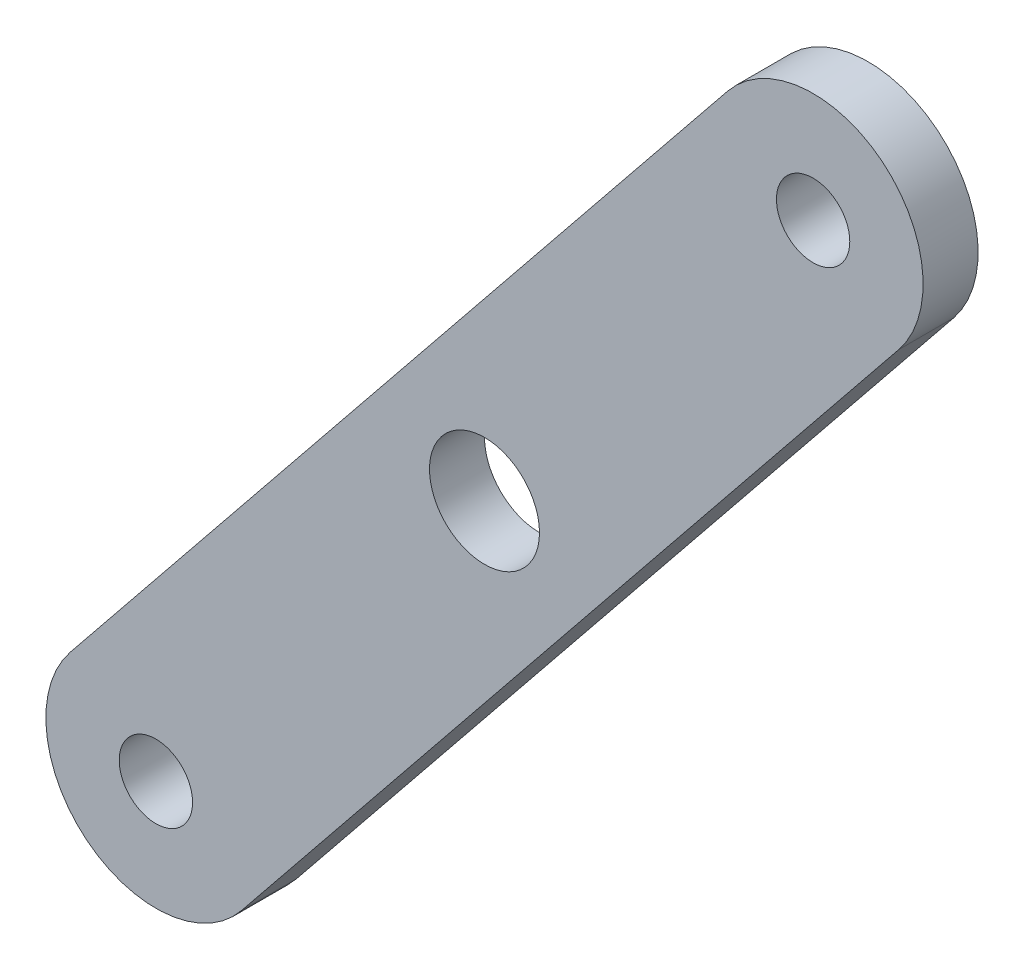
ISO-10303-21;
HEADER;
FILE_DESCRIPTION(('STEP AP214'),'2;1');
FILE_NAME('part.step','',(''),(''),'','','');
FILE_SCHEMA(('AUTOMOTIVE_DESIGN { 1 0 10303 214 1 1 1 1 }'));
ENDSEC;
DATA;
#1=APPLICATION_CONTEXT('core data for automotive mechanical design processes');
#2=APPLICATION_PROTOCOL_DEFINITION('international standard','automotive_design',2000,#1);
#3=PRODUCT_CONTEXT('',#1,'mechanical');
#4=PRODUCT('Part','Part','',(#3));
#5=PRODUCT_RELATED_PRODUCT_CATEGORY('part','',(#4));
#6=PRODUCT_DEFINITION_FORMATION('','',#4);
#7=PRODUCT_DEFINITION_CONTEXT('part definition',#1,'design');
#8=PRODUCT_DEFINITION('design','',#6,#7);
#9=PRODUCT_DEFINITION_SHAPE('','',#8);
#10=(LENGTH_UNIT() NAMED_UNIT(*) SI_UNIT(.MILLI.,.METRE.));
#11=(NAMED_UNIT(*) PLANE_ANGLE_UNIT() SI_UNIT($,.RADIAN.));
#12=(NAMED_UNIT(*) SI_UNIT($,.STERADIAN.) SOLID_ANGLE_UNIT());
#13=UNCERTAINTY_MEASURE_WITH_UNIT(LENGTH_MEASURE(1.E-05),#10,'distance_accuracy_value','');
#14=(GEOMETRIC_REPRESENTATION_CONTEXT(3) GLOBAL_UNCERTAINTY_ASSIGNED_CONTEXT((#13)) GLOBAL_UNIT_ASSIGNED_CONTEXT((#10,
#11,#12)) REPRESENTATION_CONTEXT('',''));
#15=CARTESIAN_POINT('',(0.,0.,0.));
#16=DIRECTION('',(0.,0.,1.));
#17=DIRECTION('',(1.,0.,0.));
#18=AXIS2_PLACEMENT_3D('',#15,#16,#17);
#19=CARTESIAN_POINT('',(10.899952642612,-8.75740448502151,1.5));
#20=DIRECTION('',(0.,0.,1.));
#21=DIRECTION('',(1.,0.,0.));
#22=AXIS2_PLACEMENT_3D('',#19,#20,#21);
#23=PLANE('',#22);
#24=CARTESIAN_POINT('',(28.8235524602542,13.4524169815508,1.5));
#25=DIRECTION('',(0.,0.,1.));
#26=DIRECTION('',(1.,0.,0.));
#27=AXIS2_PLACEMENT_3D('',#24,#25,#26);
#28=CIRCLE('',#27,1.);
#29=CARTESIAN_POINT('',(29.8235524602542,13.4524169815508,1.5));
#30=VERTEX_POINT('',#29);
#31=EDGE_CURVE('E117',#30,#30,#28,.T.);
#32=ORIENTED_EDGE('',*,*,#31,.F.);
#33=EDGE_LOOP('',(#32));
#34=FACE_BOUND('',#33,.T.);
#35=CARTESIAN_POINT('',(10.899952642612,-8.75740448502151,1.5));
#36=DIRECTION('',(0.,0.,1.));
#37=DIRECTION('',(1.,0.,0.));
#38=AXIS2_PLACEMENT_3D('',#35,#36,#37);
#39=CIRCLE('',#38,3.);
#40=CARTESIAN_POINT('',(8.56535332937732,-6.87335404868911,1.5));
#41=VERTEX_POINT('',#40);
#42=CARTESIAN_POINT('',(13.2345519558466,-10.6414549213539,1.5));
#43=VERTEX_POINT('',#42);
#44=EDGE_CURVE('E87',#41,#43,#39,.T.);
#45=ORIENTED_EDGE('',*,*,#44,.T.);
#46=DIRECTION('',(0.6280168121108,0.778199771078216,0.));
#47=VECTOR('',#46,1.);
#48=CARTESIAN_POINT('',(13.2345519558466,-10.6414549213539,1.5));
#49=LINE('',#48,#47);
#50=CARTESIAN_POINT('',(31.1581517734888,11.5683665452184,1.5));
#51=VERTEX_POINT('',#50);
#52=EDGE_CURVE('E82',#43,#51,#49,.T.);
#53=ORIENTED_EDGE('',*,*,#52,.T.);
#54=CARTESIAN_POINT('',(28.8235524602542,13.4524169815508,1.5));
#55=DIRECTION('',(0.,0.,1.));
#56=DIRECTION('',(1.,0.,0.));
#57=AXIS2_PLACEMENT_3D('',#54,#55,#56);
#58=CIRCLE('',#57,3.);
#59=CARTESIAN_POINT('',(26.4889531470196,15.3364674178832,1.5));
#60=VERTEX_POINT('',#59);
#61=EDGE_CURVE('E85',#51,#60,#58,.T.);
#62=ORIENTED_EDGE('',*,*,#61,.T.);
#63=DIRECTION('',(-0.6280168121108,-0.778199771078216,0.));
#64=VECTOR('',#63,1.);
#65=CARTESIAN_POINT('',(8.56535332937732,-6.87335404868911,1.5));
#66=LINE('',#65,#64);
#67=EDGE_CURVE('E52',#60,#41,#66,.T.);
#68=ORIENTED_EDGE('',*,*,#67,.T.);
#69=EDGE_LOOP('',(#45,#53,#62,#68));
#70=FACE_BOUND('',#69,.T.);
#71=CARTESIAN_POINT('',(19.8617525514331,2.34750624826463,1.5));
#72=DIRECTION('',(0.,0.,1.));
#73=DIRECTION('',(1.,0.,0.));
#74=AXIS2_PLACEMENT_3D('',#71,#72,#73);
#75=CIRCLE('',#74,1.5);
#76=CARTESIAN_POINT('',(21.3617525514331,2.34750624826463,1.5));
#77=VERTEX_POINT('',#76);
#78=EDGE_CURVE('E102',#77,#77,#75,.T.);
#79=ORIENTED_EDGE('',*,*,#78,.F.);
#80=EDGE_LOOP('',(#79));
#81=FACE_BOUND('',#80,.T.);
#82=CARTESIAN_POINT('',(10.899952642612,-8.75740448502151,1.5));
#83=DIRECTION('',(0.,0.,1.));
#84=DIRECTION('',(1.,0.,0.));
#85=AXIS2_PLACEMENT_3D('',#82,#83,#84);
#86=CIRCLE('',#85,1.);
#87=CARTESIAN_POINT('',(11.899952642612,-8.75740448502151,1.5));
#88=VERTEX_POINT('',#87);
#89=EDGE_CURVE('E123',#88,#88,#86,.T.);
#90=ORIENTED_EDGE('',*,*,#89,.F.);
#91=EDGE_LOOP('',(#90));
#92=FACE_BOUND('',#91,.T.);
#93=ADVANCED_FACE('F35',(#34,#70,#81,#92),#23,.T.);
#94=CARTESIAN_POINT('',(10.899952642612,-8.75740448502151,0.));
#95=DIRECTION('',(0.,0.,1.));
#96=DIRECTION('',(1.,0.,0.));
#97=AXIS2_PLACEMENT_3D('',#94,#95,#96);
#98=PLANE('',#97);
#99=CARTESIAN_POINT('',(10.899952642612,-8.75740448502151,0.));
#100=DIRECTION('',(0.,0.,1.));
#101=DIRECTION('',(1.,0.,0.));
#102=AXIS2_PLACEMENT_3D('',#99,#100,#101);
#103=CIRCLE('',#102,3.);
#104=CARTESIAN_POINT('',(8.56535332937732,-6.87335404868911,0.));
#105=VERTEX_POINT('',#104);
#106=CARTESIAN_POINT('',(13.2345519558466,-10.6414549213539,0.));
#107=VERTEX_POINT('',#106);
#108=EDGE_CURVE('E99',#105,#107,#103,.T.);
#109=ORIENTED_EDGE('',*,*,#108,.F.);
#110=DIRECTION('',(-0.6280168121108,-0.778199771078216,0.));
#111=VECTOR('',#110,1.);
#112=CARTESIAN_POINT('',(8.56535332937732,-6.87335404868911,0.));
#113=LINE('',#112,#111);
#114=CARTESIAN_POINT('',(26.4889531470196,15.3364674178832,0.));
#115=VERTEX_POINT('',#114);
#116=EDGE_CURVE('E75',#115,#105,#113,.T.);
#117=ORIENTED_EDGE('',*,*,#116,.F.);
#118=CARTESIAN_POINT('',(28.8235524602542,13.4524169815508,0.));
#119=DIRECTION('',(0.,0.,1.));
#120=DIRECTION('',(1.,0.,0.));
#121=AXIS2_PLACEMENT_3D('',#118,#119,#120);
#122=CIRCLE('',#121,3.);
#123=CARTESIAN_POINT('',(31.1581517734888,11.5683665452184,0.));
#124=VERTEX_POINT('',#123);
#125=EDGE_CURVE('E69',#124,#115,#122,.T.);
#126=ORIENTED_EDGE('',*,*,#125,.F.);
#127=DIRECTION('',(0.6280168121108,0.778199771078216,0.));
#128=VECTOR('',#127,1.);
#129=CARTESIAN_POINT('',(13.2345519558466,-10.6414549213539,0.));
#130=LINE('',#129,#128);
#131=EDGE_CURVE('E91',#107,#124,#130,.T.);
#132=ORIENTED_EDGE('',*,*,#131,.F.);
#133=EDGE_LOOP('',(#109,#117,#126,#132));
#134=FACE_BOUND('',#133,.T.);
#135=CARTESIAN_POINT('',(19.8617525514331,2.34750624826463,0.));
#136=DIRECTION('',(0.,0.,1.));
#137=DIRECTION('',(1.,0.,0.));
#138=AXIS2_PLACEMENT_3D('',#135,#136,#137);
#139=CIRCLE('',#138,1.5);
#140=CARTESIAN_POINT('',(21.3617525514331,2.34750624826463,0.));
#141=VERTEX_POINT('',#140);
#142=EDGE_CURVE('E114',#141,#141,#139,.T.);
#143=ORIENTED_EDGE('',*,*,#142,.T.);
#144=EDGE_LOOP('',(#143));
#145=FACE_BOUND('',#144,.T.);
#146=CARTESIAN_POINT('',(28.8235524602542,13.4524169815508,0.));
#147=DIRECTION('',(0.,0.,1.));
#148=DIRECTION('',(1.,0.,0.));
#149=AXIS2_PLACEMENT_3D('',#146,#147,#148);
#150=CIRCLE('',#149,1.);
#151=CARTESIAN_POINT('',(29.8235524602542,13.4524169815508,0.));
#152=VERTEX_POINT('',#151);
#153=EDGE_CURVE('E120',#152,#152,#150,.T.);
#154=ORIENTED_EDGE('',*,*,#153,.T.);
#155=EDGE_LOOP('',(#154));
#156=FACE_BOUND('',#155,.T.);
#157=CARTESIAN_POINT('',(10.899952642612,-8.75740448502151,0.));
#158=DIRECTION('',(0.,0.,1.));
#159=DIRECTION('',(1.,0.,0.));
#160=AXIS2_PLACEMENT_3D('',#157,#158,#159);
#161=CIRCLE('',#160,1.);
#162=CARTESIAN_POINT('',(11.899952642612,-8.75740448502151,0.));
#163=VERTEX_POINT('',#162);
#164=EDGE_CURVE('E126',#163,#163,#161,.T.);
#165=ORIENTED_EDGE('',*,*,#164,.T.);
#166=EDGE_LOOP('',(#165));
#167=FACE_BOUND('',#166,.T.);
#168=ADVANCED_FACE('F110',(#134,#145,#156,#167),#98,.F.);
#169=CARTESIAN_POINT('',(10.899952642612,-8.75740448502151,1.5));
#170=DIRECTION('',(0.,0.,-1.));
#171=DIRECTION('',(-1.,0.,0.));
#172=AXIS2_PLACEMENT_3D('',#169,#170,#171);
#173=CYLINDRICAL_SURFACE('',#172,3.);
#174=ORIENTED_EDGE('',*,*,#108,.T.);
#175=DIRECTION('',(0.,0.,-1.));
#176=VECTOR('',#175,1.);
#177=CARTESIAN_POINT('',(13.2345519558466,-10.6414549213539,1.5));
#178=LINE('',#177,#176);
#179=EDGE_CURVE('E11',#43,#107,#178,.T.);
#180=ORIENTED_EDGE('',*,*,#179,.F.);
#181=ORIENTED_EDGE('',*,*,#44,.F.);
#182=DIRECTION('',(0.,0.,-1.));
#183=VECTOR('',#182,1.);
#184=CARTESIAN_POINT('',(8.56535332937732,-6.87335404868911,1.5));
#185=LINE('',#184,#183);
#186=EDGE_CURVE('E95',#41,#105,#185,.T.);
#187=ORIENTED_EDGE('',*,*,#186,.T.);
#188=EDGE_LOOP('',(#174,#180,#181,#187));
#189=FACE_BOUND('',#188,.T.);
#190=ADVANCED_FACE('F37',(#189),#173,.T.);
#191=CARTESIAN_POINT('',(13.2345519558466,-10.6414549213539,1.5));
#192=DIRECTION('',(-0.778199771078216,0.6280168121108,0.));
#193=DIRECTION('',(-0.6280168121108,-0.778199771078216,0.));
#194=AXIS2_PLACEMENT_3D('',#191,#192,#193);
#195=PLANE('',#194);
#196=ORIENTED_EDGE('',*,*,#131,.T.);
#197=DIRECTION('',(0.,0.,-1.));
#198=VECTOR('',#197,1.);
#199=CARTESIAN_POINT('',(31.1581517734888,11.5683665452184,1.5));
#200=LINE('',#199,#198);
#201=EDGE_CURVE('E44',#51,#124,#200,.T.);
#202=ORIENTED_EDGE('',*,*,#201,.F.);
#203=ORIENTED_EDGE('',*,*,#52,.F.);
#204=ORIENTED_EDGE('',*,*,#179,.T.);
#205=EDGE_LOOP('',(#196,#202,#203,#204));
#206=FACE_BOUND('',#205,.T.);
#207=ADVANCED_FACE('F90',(#206),#195,.F.);
#208=CARTESIAN_POINT('',(28.8235524602542,13.4524169815508,1.5));
#209=DIRECTION('',(0.,0.,-1.));
#210=DIRECTION('',(-1.,0.,0.));
#211=AXIS2_PLACEMENT_3D('',#208,#209,#210);
#212=CYLINDRICAL_SURFACE('',#211,3.);
#213=ORIENTED_EDGE('',*,*,#125,.T.);
#214=DIRECTION('',(0.,0.,-1.));
#215=VECTOR('',#214,1.);
#216=CARTESIAN_POINT('',(26.4889531470196,15.3364674178832,1.5));
#217=LINE('',#216,#215);
#218=EDGE_CURVE('E92',#60,#115,#217,.T.);
#219=ORIENTED_EDGE('',*,*,#218,.F.);
#220=ORIENTED_EDGE('',*,*,#61,.F.);
#221=ORIENTED_EDGE('',*,*,#201,.T.);
#222=EDGE_LOOP('',(#213,#219,#220,#221));
#223=FACE_BOUND('',#222,.T.);
#224=ADVANCED_FACE('F93',(#223),#212,.T.);
#225=CARTESIAN_POINT('',(8.56535332937732,-6.87335404868911,1.5));
#226=DIRECTION('',(0.778199771078216,-0.6280168121108,0.));
#227=DIRECTION('',(0.6280168121108,0.778199771078216,0.));
#228=AXIS2_PLACEMENT_3D('',#225,#226,#227);
#229=PLANE('',#228);
#230=ORIENTED_EDGE('',*,*,#116,.T.);
#231=ORIENTED_EDGE('',*,*,#186,.F.);
#232=ORIENTED_EDGE('',*,*,#67,.F.);
#233=ORIENTED_EDGE('',*,*,#218,.T.);
#234=EDGE_LOOP('',(#230,#231,#232,#233));
#235=FACE_BOUND('',#234,.T.);
#236=ADVANCED_FACE('F107',(#235),#229,.F.);
#237=CARTESIAN_POINT('',(19.8617525514331,2.34750624826463,1.5));
#238=DIRECTION('',(0.,0.,-1.));
#239=DIRECTION('',(-1.,0.,0.));
#240=AXIS2_PLACEMENT_3D('',#237,#238,#239);
#241=CYLINDRICAL_SURFACE('',#240,1.5);
#242=ORIENTED_EDGE('',*,*,#78,.T.);
#243=EDGE_LOOP('',(#242));
#244=FACE_BOUND('',#243,.T.);
#245=ORIENTED_EDGE('',*,*,#142,.F.);
#246=EDGE_LOOP('',(#245));
#247=FACE_BOUND('',#246,.T.);
#248=ADVANCED_FACE('F144',(#244,#247),#241,.F.);
#249=CARTESIAN_POINT('',(28.8235524602542,13.4524169815508,1.5));
#250=DIRECTION('',(0.,0.,-1.));
#251=DIRECTION('',(-1.,0.,0.));
#252=AXIS2_PLACEMENT_3D('',#249,#250,#251);
#253=CYLINDRICAL_SURFACE('',#252,1.);
#254=ORIENTED_EDGE('',*,*,#31,.T.);
#255=EDGE_LOOP('',(#254));
#256=FACE_BOUND('',#255,.T.);
#257=ORIENTED_EDGE('',*,*,#153,.F.);
#258=EDGE_LOOP('',(#257));
#259=FACE_BOUND('',#258,.T.);
#260=ADVANCED_FACE('F190',(#256,#259),#253,.F.);
#261=CARTESIAN_POINT('',(10.899952642612,-8.75740448502151,1.5));
#262=DIRECTION('',(0.,0.,-1.));
#263=DIRECTION('',(-1.,0.,0.));
#264=AXIS2_PLACEMENT_3D('',#261,#262,#263);
#265=CYLINDRICAL_SURFACE('',#264,1.);
#266=ORIENTED_EDGE('',*,*,#89,.T.);
#267=EDGE_LOOP('',(#266));
#268=FACE_BOUND('',#267,.T.);
#269=ORIENTED_EDGE('',*,*,#164,.F.);
#270=EDGE_LOOP('',(#269));
#271=FACE_BOUND('',#270,.T.);
#272=ADVANCED_FACE('F132',(#268,#271),#265,.F.);
#273=CLOSED_SHELL('',(#93,#168,#190,#207,#224,#236,#248,#260,#272));
#274=MANIFOLD_SOLID_BREP('B2',#273);
#275=ADVANCED_BREP_SHAPE_REPRESENTATION('',(#18,#274),#14);
#276=SHAPE_DEFINITION_REPRESENTATION(#9,#275);
ENDSEC;
END-ISO-10303-21;
